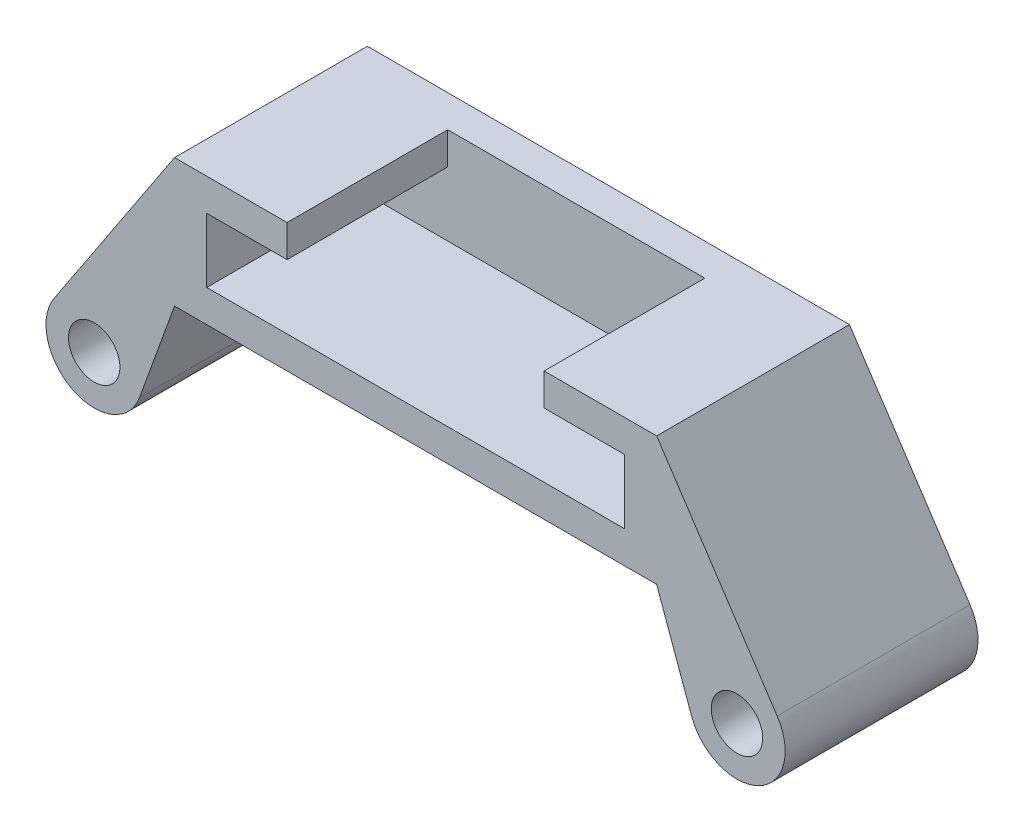
ISO-10303-21;
HEADER;
FILE_DESCRIPTION(('STEP AP214'),'2;1');
FILE_NAME('part.step','',(''),(''),'','','');
FILE_SCHEMA(('AUTOMOTIVE_DESIGN { 1 0 10303 214 1 1 1 1 }'));
ENDSEC;
DATA;
#1=APPLICATION_CONTEXT('core data for automotive mechanical design processes');
#2=APPLICATION_PROTOCOL_DEFINITION('international standard','automotive_design',2000,#1);
#3=PRODUCT_CONTEXT('',#1,'mechanical');
#4=PRODUCT('Part','Part','',(#3));
#5=PRODUCT_RELATED_PRODUCT_CATEGORY('part','',(#4));
#6=PRODUCT_DEFINITION_FORMATION('','',#4);
#7=PRODUCT_DEFINITION_CONTEXT('part definition',#1,'design');
#8=PRODUCT_DEFINITION('design','',#6,#7);
#9=PRODUCT_DEFINITION_SHAPE('','',#8);
#10=(LENGTH_UNIT() NAMED_UNIT(*) SI_UNIT(.MILLI.,.METRE.));
#11=(NAMED_UNIT(*) PLANE_ANGLE_UNIT() SI_UNIT($,.RADIAN.));
#12=(NAMED_UNIT(*) SI_UNIT($,.STERADIAN.) SOLID_ANGLE_UNIT());
#13=UNCERTAINTY_MEASURE_WITH_UNIT(LENGTH_MEASURE(1.E-05),#10,'distance_accuracy_value','');
#14=(GEOMETRIC_REPRESENTATION_CONTEXT(3) GLOBAL_UNCERTAINTY_ASSIGNED_CONTEXT((#13)) GLOBAL_UNIT_ASSIGNED_CONTEXT((#10,
#11,#12)) REPRESENTATION_CONTEXT('',''));
#15=CARTESIAN_POINT('',(0.,0.,0.));
#16=DIRECTION('',(0.,0.,1.));
#17=DIRECTION('',(1.,0.,0.));
#18=AXIS2_PLACEMENT_3D('',#15,#16,#17);
#19=CARTESIAN_POINT('',(-22.9479780691251,0.,12.));
#20=DIRECTION('',(0.,0.,1.));
#21=DIRECTION('',(1.,0.,0.));
#22=AXIS2_PLACEMENT_3D('',#19,#20,#21);
#23=PLANE('',#22);
#24=DIRECTION('',(0.,1.,0.));
#25=VECTOR('',#24,1.);
#26=CARTESIAN_POINT('',(-34.9479780691251,12.9999840036515,12.));
#27=LINE('',#26,#25);
#28=CARTESIAN_POINT('',(-34.9479780691251,10.9999840036515,12.));
#29=VERTEX_POINT('',#28);
#30=CARTESIAN_POINT('',(-34.9479780691251,12.9999840036515,12.));
#31=VERTEX_POINT('',#30);
#32=EDGE_CURVE('E232',#29,#31,#27,.T.);
#33=ORIENTED_EDGE('',*,*,#32,.F.);
#34=DIRECTION('',(-1.,0.,0.));
#35=VECTOR('',#34,1.);
#36=CARTESIAN_POINT('',(-29.9479780691251,10.9999840036515,12.));
#37=LINE('',#36,#35);
#38=CARTESIAN_POINT('',(-29.9479780691251,10.9999840036515,12.));
#39=VERTEX_POINT('',#38);
#40=EDGE_CURVE('E236',#39,#29,#37,.T.);
#41=ORIENTED_EDGE('',*,*,#40,.F.);
#42=DIRECTION('',(0.,1.,0.));
#43=VECTOR('',#42,1.);
#44=CARTESIAN_POINT('',(-29.9479780691251,6.99998400365152,12.));
#45=LINE('',#44,#43);
#46=CARTESIAN_POINT('',(-29.9479780691251,6.99998400365152,12.));
#47=VERTEX_POINT('',#46);
#48=EDGE_CURVE('E239',#47,#39,#45,.T.);
#49=ORIENTED_EDGE('',*,*,#48,.F.);
#50=DIRECTION('',(1.,0.,0.));
#51=VECTOR('',#50,1.);
#52=CARTESIAN_POINT('',(-55.9479780691251,6.99998400365152,12.));
#53=LINE('',#52,#51);
#54=CARTESIAN_POINT('',(-55.9479780691251,6.99998400365152,12.));
#55=VERTEX_POINT('',#54);
#56=EDGE_CURVE('E242',#55,#47,#53,.T.);
#57=ORIENTED_EDGE('',*,*,#56,.F.);
#58=DIRECTION('',(0.,-1.,0.));
#59=VECTOR('',#58,1.);
#60=CARTESIAN_POINT('',(-55.9479780691251,10.9999840036515,12.));
#61=LINE('',#60,#59);
#62=CARTESIAN_POINT('',(-55.9479780691251,10.9999840036515,12.));
#63=VERTEX_POINT('',#62);
#64=EDGE_CURVE('E245',#63,#55,#61,.T.);
#65=ORIENTED_EDGE('',*,*,#64,.F.);
#66=DIRECTION('',(-1.,0.,0.));
#67=VECTOR('',#66,1.);
#68=CARTESIAN_POINT('',(-50.9479780691251,10.9999840036515,12.));
#69=LINE('',#68,#67);
#70=CARTESIAN_POINT('',(-50.9479780691251,10.9999840036515,12.));
#71=VERTEX_POINT('',#70);
#72=EDGE_CURVE('E248',#71,#63,#69,.T.);
#73=ORIENTED_EDGE('',*,*,#72,.F.);
#74=DIRECTION('',(0.,-1.,0.));
#75=VECTOR('',#74,1.);
#76=CARTESIAN_POINT('',(-50.9479780691251,12.9999840036515,12.));
#77=LINE('',#76,#75);
#78=CARTESIAN_POINT('',(-50.9479780691251,12.9999840036515,12.));
#79=VERTEX_POINT('',#78);
#80=EDGE_CURVE('E251',#79,#71,#77,.T.);
#81=ORIENTED_EDGE('',*,*,#80,.F.);
#82=DIRECTION('',(-1.,0.,0.));
#83=VECTOR('',#82,1.);
#84=CARTESIAN_POINT('',(-57.9479338572196,12.9999840036515,12.));
#85=LINE('',#84,#83);
#86=CARTESIAN_POINT('',(-57.9479338572196,12.9999840036515,12.));
#87=VERTEX_POINT('',#86);
#88=EDGE_CURVE('E191',#79,#87,#85,.T.);
#89=ORIENTED_EDGE('',*,*,#88,.T.);
#90=DIRECTION('',(-0.551587094122252,-0.834117304458893,0.));
#91=VECTOR('',#90,1.);
#92=CARTESIAN_POINT('',(-57.9479338572196,12.9999840036515,12.));
#93=LINE('',#92,#91);
#94=CARTESIAN_POINT('',(-65.4503299825018,1.65476128236676,12.));
#95=VERTEX_POINT('',#94);
#96=EDGE_CURVE('E122',#87,#95,#93,.T.);
#97=ORIENTED_EDGE('',*,*,#96,.T.);
#98=CARTESIAN_POINT('',(-62.9479780691251,0.,12.));
#99=DIRECTION('',(0.,0.,1.));
#100=DIRECTION('',(1.,0.,0.));
#101=AXIS2_PLACEMENT_3D('',#98,#99,#100);
#102=CIRCLE('',#101,3.);
#103=CARTESIAN_POINT('',(-60.1270482947482,-1.02095798544014,12.));
#104=VERTEX_POINT('',#103);
#105=EDGE_CURVE('E114',#95,#104,#102,.T.);
#106=ORIENTED_EDGE('',*,*,#105,.T.);
#107=DIRECTION('',(0.340319328480048,0.940309924792294,0.));
#108=VECTOR('',#107,1.);
#109=CARTESIAN_POINT('',(-57.9479338572196,4.99998399871891,12.));
#110=LINE('',#109,#108);
#111=CARTESIAN_POINT('',(-57.9479338572196,4.99998399871891,12.));
#112=VERTEX_POINT('',#111);
#113=EDGE_CURVE('E119',#104,#112,#110,.T.);
#114=ORIENTED_EDGE('',*,*,#113,.T.);
#115=DIRECTION('',(1.,0.,0.));
#116=VECTOR('',#115,1.);
#117=CARTESIAN_POINT('',(-57.9479338572196,4.99998399871891,12.));
#118=LINE('',#117,#116);
#119=CARTESIAN_POINT('',(-27.9480222810306,4.99998399871892,12.));
#120=VERTEX_POINT('',#119);
#121=EDGE_CURVE('E57',#112,#120,#118,.T.);
#122=ORIENTED_EDGE('',*,*,#121,.T.);
#123=DIRECTION('',(0.340319328277441,-0.940309924865622,0.));
#124=VECTOR('',#123,1.);
#125=CARTESIAN_POINT('',(-27.9480222810306,4.99998399871892,12.));
#126=LINE('',#125,#124);
#127=CARTESIAN_POINT('',(-25.7689078450193,-1.02095798530185,12.));
#128=VERTEX_POINT('',#127);
#129=EDGE_CURVE('E159',#120,#128,#126,.T.);
#130=ORIENTED_EDGE('',*,*,#129,.T.);
#131=CARTESIAN_POINT('',(-22.9479780691251,0.,12.));
#132=DIRECTION('',(0.,0.,1.));
#133=DIRECTION('',(1.,0.,0.));
#134=AXIS2_PLACEMENT_3D('',#131,#132,#133);
#135=CIRCLE('',#134,3.00000000137967);
#136=CARTESIAN_POINT('',(-20.4456261547655,1.65476128338159,12.));
#137=VERTEX_POINT('',#136);
#138=EDGE_CURVE('E98',#128,#137,#135,.T.);
#139=ORIENTED_EDGE('',*,*,#138,.T.);
#140=DIRECTION('',(-0.551587094206861,0.834117304402943,0.));
#141=VECTOR('',#140,1.);
#142=CARTESIAN_POINT('',(-27.9480222810306,12.9999840036515,12.));
#143=LINE('',#142,#141);
#144=CARTESIAN_POINT('',(-27.9480222810306,12.9999840036515,12.));
#145=VERTEX_POINT('',#144);
#146=EDGE_CURVE('E174',#137,#145,#143,.T.);
#147=ORIENTED_EDGE('',*,*,#146,.T.);
#148=EDGE_CURVE('E189',#145,#31,#85,.T.);
#149=ORIENTED_EDGE('',*,*,#148,.T.);
#150=EDGE_LOOP('',(#33,#41,#49,#57,#65,#73,#81,#89,#97,#106,#114,#122,#130,#139,#147,#149));
#151=FACE_BOUND('',#150,.T.);
#152=CARTESIAN_POINT('',(-62.9479780691251,0.,12.));
#153=DIRECTION('',(0.,0.,1.));
#154=DIRECTION('',(1.,0.,0.));
#155=AXIS2_PLACEMENT_3D('',#152,#153,#154);
#156=CIRCLE('',#155,1.6);
#157=CARTESIAN_POINT('',(-61.3479780691251,0.,12.));
#158=VERTEX_POINT('',#157);
#159=EDGE_CURVE('E147',#158,#158,#156,.T.);
#160=ORIENTED_EDGE('',*,*,#159,.F.);
#161=EDGE_LOOP('',(#160));
#162=FACE_BOUND('',#161,.T.);
#163=CARTESIAN_POINT('',(-22.9479780691251,0.,12.));
#164=DIRECTION('',(0.,0.,1.));
#165=DIRECTION('',(1.,0.,0.));
#166=AXIS2_PLACEMENT_3D('',#163,#164,#165);
#167=CIRCLE('',#166,1.6);
#168=CARTESIAN_POINT('',(-21.3479780691251,0.,12.));
#169=VERTEX_POINT('',#168);
#170=EDGE_CURVE('E200',#169,#169,#167,.T.);
#171=ORIENTED_EDGE('',*,*,#170,.F.);
#172=EDGE_LOOP('',(#171));
#173=FACE_BOUND('',#172,.T.);
#174=ADVANCED_FACE('F33',(#151,#162,#173),#23,.T.);
#175=CARTESIAN_POINT('',(-22.9479780691251,0.,0.));
#176=DIRECTION('',(0.,0.,1.));
#177=DIRECTION('',(1.,0.,0.));
#178=AXIS2_PLACEMENT_3D('',#175,#176,#177);
#179=PLANE('',#178);
#180=DIRECTION('',(0.340319328277441,-0.940309924865622,0.));
#181=VECTOR('',#180,1.);
#182=CARTESIAN_POINT('',(-27.9480222810306,4.99998399871892,0.));
#183=LINE('',#182,#181);
#184=CARTESIAN_POINT('',(-27.9480222810306,4.99998399871892,0.));
#185=VERTEX_POINT('',#184);
#186=CARTESIAN_POINT('',(-25.7689078450193,-1.02095798530185,0.));
#187=VERTEX_POINT('',#186);
#188=EDGE_CURVE('E143',#185,#187,#183,.T.);
#189=ORIENTED_EDGE('',*,*,#188,.F.);
#190=DIRECTION('',(1.,0.,0.));
#191=VECTOR('',#190,1.);
#192=CARTESIAN_POINT('',(-57.9479338572196,4.99998399871891,0.));
#193=LINE('',#192,#191);
#194=CARTESIAN_POINT('',(-57.9479338572196,4.99998399871891,0.));
#195=VERTEX_POINT('',#194);
#196=EDGE_CURVE('E90',#195,#185,#193,.T.);
#197=ORIENTED_EDGE('',*,*,#196,.F.);
#198=DIRECTION('',(0.340319328480048,0.940309924792294,0.));
#199=VECTOR('',#198,1.);
#200=CARTESIAN_POINT('',(-57.9479338572196,4.99998399871891,0.));
#201=LINE('',#200,#199);
#202=CARTESIAN_POINT('',(-60.1270482947482,-1.02095798544014,0.));
#203=VERTEX_POINT('',#202);
#204=EDGE_CURVE('E156',#203,#195,#201,.T.);
#205=ORIENTED_EDGE('',*,*,#204,.F.);
#206=CARTESIAN_POINT('',(-62.9479780691251,0.,0.));
#207=DIRECTION('',(0.,0.,1.));
#208=DIRECTION('',(1.,0.,0.));
#209=AXIS2_PLACEMENT_3D('',#206,#207,#208);
#210=CIRCLE('',#209,3.);
#211=CARTESIAN_POINT('',(-65.4503299825018,1.65476128236676,0.));
#212=VERTEX_POINT('',#211);
#213=EDGE_CURVE('E131',#212,#203,#210,.T.);
#214=ORIENTED_EDGE('',*,*,#213,.F.);
#215=DIRECTION('',(-0.551587094122252,-0.834117304458893,0.));
#216=VECTOR('',#215,1.);
#217=CARTESIAN_POINT('',(-57.9479338572196,12.9999840036515,0.));
#218=LINE('',#217,#216);
#219=CARTESIAN_POINT('',(-57.9479338572196,12.9999840036515,0.));
#220=VERTEX_POINT('',#219);
#221=EDGE_CURVE('E153',#220,#212,#218,.T.);
#222=ORIENTED_EDGE('',*,*,#221,.F.);
#223=DIRECTION('',(-1.,0.,0.));
#224=VECTOR('',#223,1.);
#225=CARTESIAN_POINT('',(-57.9479338572196,12.9999840036515,0.));
#226=LINE('',#225,#224);
#227=CARTESIAN_POINT('',(-27.9480222810306,12.9999840036515,0.));
#228=VERTEX_POINT('',#227);
#229=EDGE_CURVE('E151',#228,#220,#226,.T.);
#230=ORIENTED_EDGE('',*,*,#229,.F.);
#231=DIRECTION('',(-0.551587094206861,0.834117304402943,0.));
#232=VECTOR('',#231,1.);
#233=CARTESIAN_POINT('',(-27.9480222810306,12.9999840036515,0.));
#234=LINE('',#233,#232);
#235=CARTESIAN_POINT('',(-20.4456261547655,1.65476128338159,0.));
#236=VERTEX_POINT('',#235);
#237=EDGE_CURVE('E149',#236,#228,#234,.T.);
#238=ORIENTED_EDGE('',*,*,#237,.F.);
#239=CARTESIAN_POINT('',(-22.9479780691251,0.,0.));
#240=DIRECTION('',(0.,0.,1.));
#241=DIRECTION('',(1.,0.,0.));
#242=AXIS2_PLACEMENT_3D('',#239,#240,#241);
#243=CIRCLE('',#242,3.00000000137967);
#244=EDGE_CURVE('E146',#187,#236,#243,.T.);
#245=ORIENTED_EDGE('',*,*,#244,.F.);
#246=EDGE_LOOP('',(#189,#197,#205,#214,#222,#230,#238,#245));
#247=FACE_BOUND('',#246,.T.);
#248=CARTESIAN_POINT('',(-62.9479780691251,0.,0.));
#249=DIRECTION('',(0.,0.,1.));
#250=DIRECTION('',(1.,0.,0.));
#251=AXIS2_PLACEMENT_3D('',#248,#249,#250);
#252=CIRCLE('',#251,1.6);
#253=CARTESIAN_POINT('',(-61.3479780691251,0.,0.));
#254=VERTEX_POINT('',#253);
#255=EDGE_CURVE('E197',#254,#254,#252,.T.);
#256=ORIENTED_EDGE('',*,*,#255,.T.);
#257=EDGE_LOOP('',(#256));
#258=FACE_BOUND('',#257,.T.);
#259=CARTESIAN_POINT('',(-22.9479780691251,0.,0.));
#260=DIRECTION('',(0.,0.,1.));
#261=DIRECTION('',(1.,0.,0.));
#262=AXIS2_PLACEMENT_3D('',#259,#260,#261);
#263=CIRCLE('',#262,1.6);
#264=CARTESIAN_POINT('',(-21.3479780691251,0.,0.));
#265=VERTEX_POINT('',#264);
#266=EDGE_CURVE('E203',#265,#265,#263,.T.);
#267=ORIENTED_EDGE('',*,*,#266,.T.);
#268=EDGE_LOOP('',(#267));
#269=FACE_BOUND('',#268,.T.);
#270=ADVANCED_FACE('F178',(#247,#258,#269),#179,.F.);
#271=CARTESIAN_POINT('',(-27.9480222810306,4.99998399871892,12.));
#272=DIRECTION('',(0.940309924865622,0.340319328277441,0.));
#273=DIRECTION('',(-0.340319328277441,0.940309924865622,0.));
#274=AXIS2_PLACEMENT_3D('',#271,#272,#273);
#275=PLANE('',#274);
#276=ORIENTED_EDGE('',*,*,#188,.T.);
#277=DIRECTION('',(0.,0.,-1.));
#278=VECTOR('',#277,1.);
#279=CARTESIAN_POINT('',(-25.7689078450193,-1.02095798530185,12.));
#280=LINE('',#279,#278);
#281=EDGE_CURVE('E11',#128,#187,#280,.T.);
#282=ORIENTED_EDGE('',*,*,#281,.F.);
#283=ORIENTED_EDGE('',*,*,#129,.F.);
#284=DIRECTION('',(0.,0.,-1.));
#285=VECTOR('',#284,1.);
#286=CARTESIAN_POINT('',(-27.9480222810306,4.99998399871892,12.));
#287=LINE('',#286,#285);
#288=EDGE_CURVE('E139',#120,#185,#287,.T.);
#289=ORIENTED_EDGE('',*,*,#288,.T.);
#290=EDGE_LOOP('',(#276,#282,#283,#289));
#291=FACE_BOUND('',#290,.T.);
#292=ADVANCED_FACE('F35',(#291),#275,.F.);
#293=CARTESIAN_POINT('',(-22.9479780691251,0.,12.));
#294=DIRECTION('',(0.,0.,-1.));
#295=DIRECTION('',(-1.,0.,0.));
#296=AXIS2_PLACEMENT_3D('',#293,#294,#295);
#297=CYLINDRICAL_SURFACE('',#296,3.00000000137967);
#298=ORIENTED_EDGE('',*,*,#244,.T.);
#299=DIRECTION('',(0.,0.,-1.));
#300=VECTOR('',#299,1.);
#301=CARTESIAN_POINT('',(-20.4456261547655,1.65476128338159,12.));
#302=LINE('',#301,#300);
#303=EDGE_CURVE('E41',#137,#236,#302,.T.);
#304=ORIENTED_EDGE('',*,*,#303,.F.);
#305=ORIENTED_EDGE('',*,*,#138,.F.);
#306=ORIENTED_EDGE('',*,*,#281,.T.);
#307=EDGE_LOOP('',(#298,#304,#305,#306));
#308=FACE_BOUND('',#307,.T.);
#309=ADVANCED_FACE('F312',(#308),#297,.T.);
#310=CARTESIAN_POINT('',(-27.9480222810306,12.9999840036515,12.));
#311=DIRECTION('',(-0.834117304402943,-0.551587094206861,0.));
#312=DIRECTION('',(0.551587094206861,-0.834117304402943,0.));
#313=AXIS2_PLACEMENT_3D('',#310,#311,#312);
#314=PLANE('',#313);
#315=ORIENTED_EDGE('',*,*,#237,.T.);
#316=DIRECTION('',(0.,0.,-1.));
#317=VECTOR('',#316,1.);
#318=CARTESIAN_POINT('',(-27.9480222810306,12.9999840036515,12.));
#319=LINE('',#318,#317);
#320=EDGE_CURVE('E166',#145,#228,#319,.T.);
#321=ORIENTED_EDGE('',*,*,#320,.F.);
#322=ORIENTED_EDGE('',*,*,#146,.F.);
#323=ORIENTED_EDGE('',*,*,#303,.T.);
#324=EDGE_LOOP('',(#315,#321,#322,#323));
#325=FACE_BOUND('',#324,.T.);
#326=ADVANCED_FACE('F172',(#325),#314,.F.);
#327=CARTESIAN_POINT('',(-57.9479338572196,12.9999840036515,12.));
#328=DIRECTION('',(0.,-1.,0.));
#329=DIRECTION('',(1.,0.,0.));
#330=AXIS2_PLACEMENT_3D('',#327,#328,#329);
#331=PLANE('',#330);
#332=DIRECTION('',(-1.,0.,0.));
#333=VECTOR('',#332,1.);
#334=CARTESIAN_POINT('',(-42.9479780691251,12.9999840036515,2.));
#335=LINE('',#334,#333);
#336=CARTESIAN_POINT('',(-34.9479780691251,12.9999840036515,2.));
#337=VERTEX_POINT('',#336);
#338=CARTESIAN_POINT('',(-50.9479780691251,12.9999840036515,2.));
#339=VERTEX_POINT('',#338);
#340=EDGE_CURVE('E235',#337,#339,#335,.T.);
#341=ORIENTED_EDGE('',*,*,#340,.F.);
#342=DIRECTION('',(0.,0.,1.));
#343=VECTOR('',#342,1.);
#344=CARTESIAN_POINT('',(-34.9479780691251,12.9999840036515,2.));
#345=LINE('',#344,#343);
#346=EDGE_CURVE('E206',#337,#31,#345,.T.);
#347=ORIENTED_EDGE('',*,*,#346,.T.);
#348=ORIENTED_EDGE('',*,*,#148,.F.);
#349=ORIENTED_EDGE('',*,*,#320,.T.);
#350=ORIENTED_EDGE('',*,*,#229,.T.);
#351=DIRECTION('',(0.,0.,-1.));
#352=VECTOR('',#351,1.);
#353=CARTESIAN_POINT('',(-57.9479338572196,12.9999840036515,12.));
#354=LINE('',#353,#352);
#355=EDGE_CURVE('E163',#87,#220,#354,.T.);
#356=ORIENTED_EDGE('',*,*,#355,.F.);
#357=ORIENTED_EDGE('',*,*,#88,.F.);
#358=DIRECTION('',(0.,0.,1.));
#359=VECTOR('',#358,1.);
#360=CARTESIAN_POINT('',(-50.9479780691251,12.9999840036515,2.));
#361=LINE('',#360,#359);
#362=EDGE_CURVE('E209',#339,#79,#361,.T.);
#363=ORIENTED_EDGE('',*,*,#362,.F.);
#364=EDGE_LOOP('',(#341,#347,#348,#349,#350,#356,#357,#363));
#365=FACE_BOUND('',#364,.T.);
#366=ADVANCED_FACE('F184',(#365),#331,.F.);
#367=CARTESIAN_POINT('',(-57.9479338572196,12.9999840036515,12.));
#368=DIRECTION('',(0.834117304458893,-0.551587094122252,0.));
#369=DIRECTION('',(0.551587094122252,0.834117304458893,0.));
#370=AXIS2_PLACEMENT_3D('',#367,#368,#369);
#371=PLANE('',#370);
#372=ORIENTED_EDGE('',*,*,#221,.T.);
#373=DIRECTION('',(0.,0.,-1.));
#374=VECTOR('',#373,1.);
#375=CARTESIAN_POINT('',(-65.4503299825018,1.65476128236676,12.));
#376=LINE('',#375,#374);
#377=EDGE_CURVE('E134',#95,#212,#376,.T.);
#378=ORIENTED_EDGE('',*,*,#377,.F.);
#379=ORIENTED_EDGE('',*,*,#96,.F.);
#380=ORIENTED_EDGE('',*,*,#355,.T.);
#381=EDGE_LOOP('',(#372,#378,#379,#380));
#382=FACE_BOUND('',#381,.T.);
#383=ADVANCED_FACE('F188',(#382),#371,.F.);
#384=CARTESIAN_POINT('',(-62.9479780691251,0.,12.));
#385=DIRECTION('',(0.,0.,-1.));
#386=DIRECTION('',(-1.,0.,0.));
#387=AXIS2_PLACEMENT_3D('',#384,#385,#386);
#388=CYLINDRICAL_SURFACE('',#387,3.);
#389=ORIENTED_EDGE('',*,*,#213,.T.);
#390=DIRECTION('',(0.,0.,-1.));
#391=VECTOR('',#390,1.);
#392=CARTESIAN_POINT('',(-60.1270482947482,-1.02095798544014,12.));
#393=LINE('',#392,#391);
#394=EDGE_CURVE('E128',#104,#203,#393,.T.);
#395=ORIENTED_EDGE('',*,*,#394,.F.);
#396=ORIENTED_EDGE('',*,*,#105,.F.);
#397=ORIENTED_EDGE('',*,*,#377,.T.);
#398=EDGE_LOOP('',(#389,#395,#396,#397));
#399=FACE_BOUND('',#398,.T.);
#400=ADVANCED_FACE('F129',(#399),#388,.T.);
#401=CARTESIAN_POINT('',(-57.9479338572196,4.99998399871891,12.));
#402=DIRECTION('',(-0.940309924792294,0.340319328480048,0.));
#403=DIRECTION('',(-0.340319328480048,-0.940309924792294,0.));
#404=AXIS2_PLACEMENT_3D('',#401,#402,#403);
#405=PLANE('',#404);
#406=ORIENTED_EDGE('',*,*,#204,.T.);
#407=DIRECTION('',(0.,0.,-1.));
#408=VECTOR('',#407,1.);
#409=CARTESIAN_POINT('',(-57.9479338572196,4.99998399871891,12.));
#410=LINE('',#409,#408);
#411=EDGE_CURVE('E135',#112,#195,#410,.T.);
#412=ORIENTED_EDGE('',*,*,#411,.F.);
#413=ORIENTED_EDGE('',*,*,#113,.F.);
#414=ORIENTED_EDGE('',*,*,#394,.T.);
#415=EDGE_LOOP('',(#406,#412,#413,#414));
#416=FACE_BOUND('',#415,.T.);
#417=ADVANCED_FACE('F137',(#416),#405,.F.);
#418=CARTESIAN_POINT('',(-57.9479338572196,4.99998399871891,12.));
#419=DIRECTION('',(0.,1.,0.));
#420=DIRECTION('',(-1.,0.,0.));
#421=AXIS2_PLACEMENT_3D('',#418,#419,#420);
#422=PLANE('',#421);
#423=ORIENTED_EDGE('',*,*,#196,.T.);
#424=ORIENTED_EDGE('',*,*,#288,.F.);
#425=ORIENTED_EDGE('',*,*,#121,.F.);
#426=ORIENTED_EDGE('',*,*,#411,.T.);
#427=EDGE_LOOP('',(#423,#424,#425,#426));
#428=FACE_BOUND('',#427,.T.);
#429=ADVANCED_FACE('F329',(#428),#422,.F.);
#430=CARTESIAN_POINT('',(-62.9479780691251,0.,12.));
#431=DIRECTION('',(0.,0.,-1.));
#432=DIRECTION('',(-1.,0.,0.));
#433=AXIS2_PLACEMENT_3D('',#430,#431,#432);
#434=CYLINDRICAL_SURFACE('',#433,1.6);
#435=ORIENTED_EDGE('',*,*,#159,.T.);
#436=EDGE_LOOP('',(#435));
#437=FACE_BOUND('',#436,.T.);
#438=ORIENTED_EDGE('',*,*,#255,.F.);
#439=EDGE_LOOP('',(#438));
#440=FACE_BOUND('',#439,.T.);
#441=ADVANCED_FACE('F326',(#437,#440),#434,.F.);
#442=CARTESIAN_POINT('',(-22.9479780691251,0.,12.));
#443=DIRECTION('',(0.,0.,-1.));
#444=DIRECTION('',(-1.,0.,0.));
#445=AXIS2_PLACEMENT_3D('',#442,#443,#444);
#446=CYLINDRICAL_SURFACE('',#445,1.6);
#447=ORIENTED_EDGE('',*,*,#170,.T.);
#448=EDGE_LOOP('',(#447));
#449=FACE_BOUND('',#448,.T.);
#450=ORIENTED_EDGE('',*,*,#266,.F.);
#451=EDGE_LOOP('',(#450));
#452=FACE_BOUND('',#451,.T.);
#453=ADVANCED_FACE('F366',(#449,#452),#446,.F.);
#454=CARTESIAN_POINT('',(-34.9479780691251,12.9999840036515,2.));
#455=DIRECTION('',(1.,0.,0.));
#456=DIRECTION('',(0.,0.,-1.));
#457=AXIS2_PLACEMENT_3D('',#454,#455,#456);
#458=PLANE('',#457);
#459=ORIENTED_EDGE('',*,*,#32,.T.);
#460=ORIENTED_EDGE('',*,*,#346,.F.);
#461=DIRECTION('',(0.,1.,0.));
#462=VECTOR('',#461,1.);
#463=CARTESIAN_POINT('',(-34.9479780691251,12.9999840036515,2.));
#464=LINE('',#463,#462);
#465=CARTESIAN_POINT('',(-34.9479780691251,10.9999840036515,2.));
#466=VERTEX_POINT('',#465);
#467=EDGE_CURVE('E48',#466,#337,#464,.T.);
#468=ORIENTED_EDGE('',*,*,#467,.F.);
#469=DIRECTION('',(0.,0.,1.));
#470=VECTOR('',#469,1.);
#471=CARTESIAN_POINT('',(-34.9479780691251,10.9999840036515,2.));
#472=LINE('',#471,#470);
#473=EDGE_CURVE('E227',#466,#29,#472,.T.);
#474=ORIENTED_EDGE('',*,*,#473,.T.);
#475=EDGE_LOOP('',(#459,#460,#468,#474));
#476=FACE_BOUND('',#475,.T.);
#477=ADVANCED_FACE('F307',(#476),#458,.F.);
#478=CARTESIAN_POINT('',(-29.9479780691251,10.9999840036515,2.));
#479=DIRECTION('',(0.,1.,0.));
#480=DIRECTION('',(0.,0.,1.));
#481=AXIS2_PLACEMENT_3D('',#478,#479,#480);
#482=PLANE('',#481);
#483=ORIENTED_EDGE('',*,*,#40,.T.);
#484=ORIENTED_EDGE('',*,*,#473,.F.);
#485=DIRECTION('',(-1.,0.,0.));
#486=VECTOR('',#485,1.);
#487=CARTESIAN_POINT('',(-29.9479780691251,10.9999840036515,2.));
#488=LINE('',#487,#486);
#489=CARTESIAN_POINT('',(-29.9479780691251,10.9999840036515,2.));
#490=VERTEX_POINT('',#489);
#491=EDGE_CURVE('E255',#490,#466,#488,.T.);
#492=ORIENTED_EDGE('',*,*,#491,.F.);
#493=DIRECTION('',(0.,0.,1.));
#494=VECTOR('',#493,1.);
#495=CARTESIAN_POINT('',(-29.9479780691251,10.9999840036515,2.));
#496=LINE('',#495,#494);
#497=EDGE_CURVE('E224',#490,#39,#496,.T.);
#498=ORIENTED_EDGE('',*,*,#497,.T.);
#499=EDGE_LOOP('',(#483,#484,#492,#498));
#500=FACE_BOUND('',#499,.T.);
#501=ADVANCED_FACE('F378',(#500),#482,.F.);
#502=CARTESIAN_POINT('',(-29.9479780691251,6.99998400365152,2.));
#503=DIRECTION('',(1.,0.,0.));
#504=DIRECTION('',(0.,0.,-1.));
#505=AXIS2_PLACEMENT_3D('',#502,#503,#504);
#506=PLANE('',#505);
#507=ORIENTED_EDGE('',*,*,#48,.T.);
#508=ORIENTED_EDGE('',*,*,#497,.F.);
#509=DIRECTION('',(0.,1.,0.));
#510=VECTOR('',#509,1.);
#511=CARTESIAN_POINT('',(-29.9479780691251,6.99998400365152,2.));
#512=LINE('',#511,#510);
#513=CARTESIAN_POINT('',(-29.9479780691251,6.99998400365152,2.));
#514=VERTEX_POINT('',#513);
#515=EDGE_CURVE('E257',#514,#490,#512,.T.);
#516=ORIENTED_EDGE('',*,*,#515,.F.);
#517=DIRECTION('',(0.,0.,1.));
#518=VECTOR('',#517,1.);
#519=CARTESIAN_POINT('',(-29.9479780691251,6.99998400365152,2.));
#520=LINE('',#519,#518);
#521=EDGE_CURVE('E221',#514,#47,#520,.T.);
#522=ORIENTED_EDGE('',*,*,#521,.T.);
#523=EDGE_LOOP('',(#507,#508,#516,#522));
#524=FACE_BOUND('',#523,.T.);
#525=ADVANCED_FACE('F385',(#524),#506,.F.);
#526=CARTESIAN_POINT('',(-55.9479780691251,6.99998400365152,2.));
#527=DIRECTION('',(0.,-1.,0.));
#528=DIRECTION('',(0.,0.,-1.));
#529=AXIS2_PLACEMENT_3D('',#526,#527,#528);
#530=PLANE('',#529);
#531=ORIENTED_EDGE('',*,*,#56,.T.);
#532=ORIENTED_EDGE('',*,*,#521,.F.);
#533=DIRECTION('',(1.,0.,0.));
#534=VECTOR('',#533,1.);
#535=CARTESIAN_POINT('',(-55.9479780691251,6.99998400365152,2.));
#536=LINE('',#535,#534);
#537=CARTESIAN_POINT('',(-55.9479780691251,6.99998400365152,2.));
#538=VERTEX_POINT('',#537);
#539=EDGE_CURVE('E260',#538,#514,#536,.T.);
#540=ORIENTED_EDGE('',*,*,#539,.F.);
#541=DIRECTION('',(0.,0.,1.));
#542=VECTOR('',#541,1.);
#543=CARTESIAN_POINT('',(-55.9479780691251,6.99998400365152,2.));
#544=LINE('',#543,#542);
#545=EDGE_CURVE('E218',#538,#55,#544,.T.);
#546=ORIENTED_EDGE('',*,*,#545,.T.);
#547=EDGE_LOOP('',(#531,#532,#540,#546));
#548=FACE_BOUND('',#547,.T.);
#549=ADVANCED_FACE('F393',(#548),#530,.F.);
#550=CARTESIAN_POINT('',(-55.9479780691251,10.9999840036515,2.));
#551=DIRECTION('',(-1.,0.,0.));
#552=DIRECTION('',(0.,0.,1.));
#553=AXIS2_PLACEMENT_3D('',#550,#551,#552);
#554=PLANE('',#553);
#555=ORIENTED_EDGE('',*,*,#64,.T.);
#556=ORIENTED_EDGE('',*,*,#545,.F.);
#557=DIRECTION('',(0.,-1.,0.));
#558=VECTOR('',#557,1.);
#559=CARTESIAN_POINT('',(-55.9479780691251,10.9999840036515,2.));
#560=LINE('',#559,#558);
#561=CARTESIAN_POINT('',(-55.9479780691251,10.9999840036515,2.));
#562=VERTEX_POINT('',#561);
#563=EDGE_CURVE('E263',#562,#538,#560,.T.);
#564=ORIENTED_EDGE('',*,*,#563,.F.);
#565=DIRECTION('',(0.,0.,1.));
#566=VECTOR('',#565,1.);
#567=CARTESIAN_POINT('',(-55.9479780691251,10.9999840036515,2.));
#568=LINE('',#567,#566);
#569=EDGE_CURVE('E215',#562,#63,#568,.T.);
#570=ORIENTED_EDGE('',*,*,#569,.T.);
#571=EDGE_LOOP('',(#555,#556,#564,#570));
#572=FACE_BOUND('',#571,.T.);
#573=ADVANCED_FACE('F401',(#572),#554,.F.);
#574=CARTESIAN_POINT('',(-50.9479780691251,10.9999840036515,2.));
#575=DIRECTION('',(0.,1.,0.));
#576=DIRECTION('',(0.,0.,1.));
#577=AXIS2_PLACEMENT_3D('',#574,#575,#576);
#578=PLANE('',#577);
#579=ORIENTED_EDGE('',*,*,#72,.T.);
#580=ORIENTED_EDGE('',*,*,#569,.F.);
#581=DIRECTION('',(-1.,0.,0.));
#582=VECTOR('',#581,1.);
#583=CARTESIAN_POINT('',(-50.9479780691251,10.9999840036515,2.));
#584=LINE('',#583,#582);
#585=CARTESIAN_POINT('',(-50.9479780691251,10.9999840036515,2.));
#586=VERTEX_POINT('',#585);
#587=EDGE_CURVE('E266',#586,#562,#584,.T.);
#588=ORIENTED_EDGE('',*,*,#587,.F.);
#589=DIRECTION('',(0.,0.,1.));
#590=VECTOR('',#589,1.);
#591=CARTESIAN_POINT('',(-50.9479780691251,10.9999840036515,2.));
#592=LINE('',#591,#590);
#593=EDGE_CURVE('E212',#586,#71,#592,.T.);
#594=ORIENTED_EDGE('',*,*,#593,.T.);
#595=EDGE_LOOP('',(#579,#580,#588,#594));
#596=FACE_BOUND('',#595,.T.);
#597=ADVANCED_FACE('F292',(#596),#578,.F.);
#598=CARTESIAN_POINT('',(-50.9479780691251,12.9999840036515,2.));
#599=DIRECTION('',(-1.,0.,0.));
#600=DIRECTION('',(0.,0.,1.));
#601=AXIS2_PLACEMENT_3D('',#598,#599,#600);
#602=PLANE('',#601);
#603=ORIENTED_EDGE('',*,*,#80,.T.);
#604=ORIENTED_EDGE('',*,*,#593,.F.);
#605=DIRECTION('',(0.,-1.,0.));
#606=VECTOR('',#605,1.);
#607=CARTESIAN_POINT('',(-50.9479780691251,12.9999840036515,2.));
#608=LINE('',#607,#606);
#609=EDGE_CURVE('E269',#339,#586,#608,.T.);
#610=ORIENTED_EDGE('',*,*,#609,.F.);
#611=ORIENTED_EDGE('',*,*,#362,.T.);
#612=EDGE_LOOP('',(#603,#604,#610,#611));
#613=FACE_BOUND('',#612,.T.);
#614=ADVANCED_FACE('F281',(#613),#602,.F.);
#615=CARTESIAN_POINT('',(0.,0.,2.));
#616=DIRECTION('',(0.,0.,1.));
#617=DIRECTION('',(1.,0.,0.));
#618=AXIS2_PLACEMENT_3D('',#615,#616,#617);
#619=PLANE('',#618);
#620=ORIENTED_EDGE('',*,*,#340,.T.);
#621=ORIENTED_EDGE('',*,*,#609,.T.);
#622=ORIENTED_EDGE('',*,*,#587,.T.);
#623=ORIENTED_EDGE('',*,*,#563,.T.);
#624=ORIENTED_EDGE('',*,*,#539,.T.);
#625=ORIENTED_EDGE('',*,*,#515,.T.);
#626=ORIENTED_EDGE('',*,*,#491,.T.);
#627=ORIENTED_EDGE('',*,*,#467,.T.);
#628=EDGE_LOOP('',(#620,#621,#622,#623,#624,#625,#626,#627));
#629=FACE_BOUND('',#628,.T.);
#630=ADVANCED_FACE('F274',(#629),#619,.T.);
#631=CLOSED_SHELL('',(#174,#270,#292,#309,#326,#366,#383,#400,#417,#429,#441,#453,#477,#501,
#525,#549,#573,#597,#614,#630));
#632=MANIFOLD_SOLID_BREP('B2',#631);
#633=ADVANCED_BREP_SHAPE_REPRESENTATION('',(#18,#632),#14);
#634=SHAPE_DEFINITION_REPRESENTATION(#9,#633);
ENDSEC;
END-ISO-10303-21;
